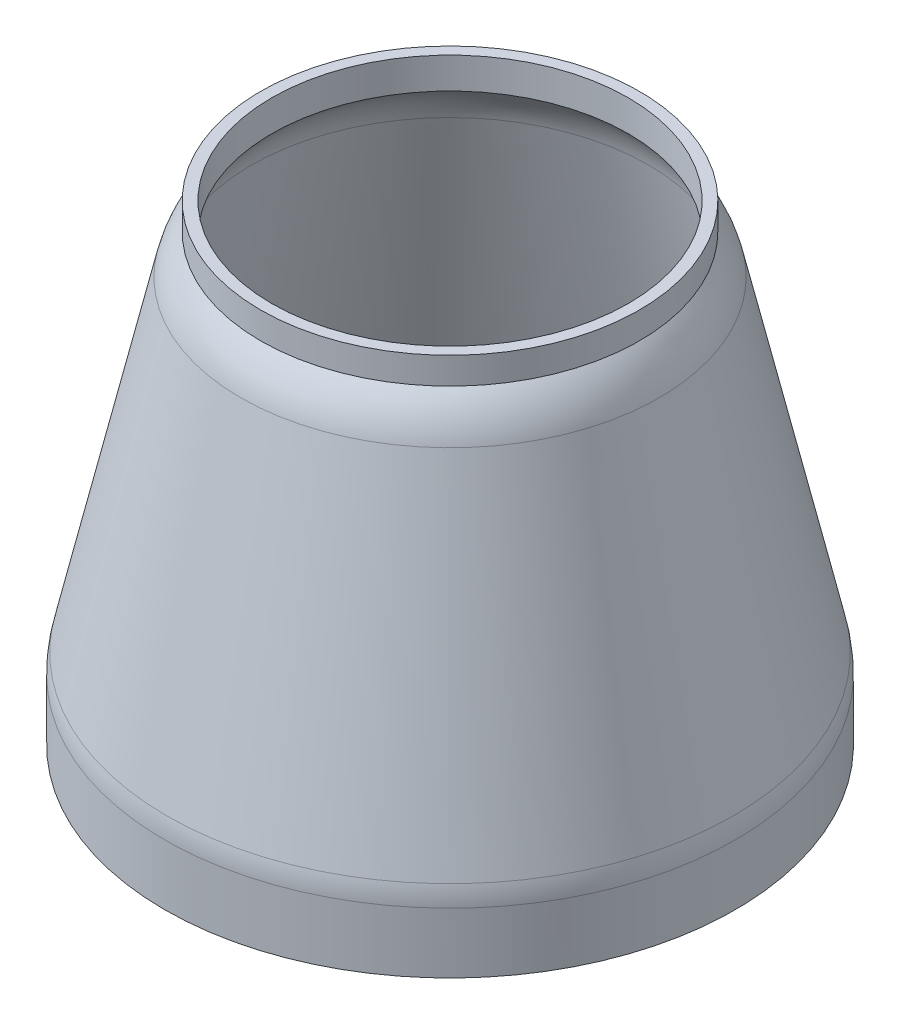
ISO-10303-21;
HEADER;
FILE_DESCRIPTION(('STEP AP214'),'2;1');
FILE_NAME('part.step','',(''),(''),'','','');
FILE_SCHEMA(('AUTOMOTIVE_DESIGN { 1 0 10303 214 1 1 1 1 }'));
ENDSEC;
DATA;
#1=APPLICATION_CONTEXT('core data for automotive mechanical design processes');
#2=APPLICATION_PROTOCOL_DEFINITION('international standard','automotive_design',2000,#1);
#3=PRODUCT_CONTEXT('',#1,'mechanical');
#4=PRODUCT('Part','Part','',(#3));
#5=PRODUCT_RELATED_PRODUCT_CATEGORY('part','',(#4));
#6=PRODUCT_DEFINITION_FORMATION('','',#4);
#7=PRODUCT_DEFINITION_CONTEXT('part definition',#1,'design');
#8=PRODUCT_DEFINITION('design','',#6,#7);
#9=PRODUCT_DEFINITION_SHAPE('','',#8);
#10=(LENGTH_UNIT() NAMED_UNIT(*) SI_UNIT(.MILLI.,.METRE.));
#11=(NAMED_UNIT(*) PLANE_ANGLE_UNIT() SI_UNIT($,.RADIAN.));
#12=(NAMED_UNIT(*) SI_UNIT($,.STERADIAN.) SOLID_ANGLE_UNIT());
#13=UNCERTAINTY_MEASURE_WITH_UNIT(LENGTH_MEASURE(1.E-05),#10,'distance_accuracy_value','');
#14=(GEOMETRIC_REPRESENTATION_CONTEXT(3) GLOBAL_UNCERTAINTY_ASSIGNED_CONTEXT((#13)) GLOBAL_UNIT_ASSIGNED_CONTEXT((#10,
#11,#12)) REPRESENTATION_CONTEXT('',''));
#15=CARTESIAN_POINT('',(0.,0.,0.));
#16=DIRECTION('',(0.,0.,1.));
#17=DIRECTION('',(1.,0.,0.));
#18=AXIS2_PLACEMENT_3D('',#15,#16,#17);
#19=CARTESIAN_POINT('',(0.,15.8,0.));
#20=DIRECTION('',(0.,-1.,0.));
#21=DIRECTION('',(0.,0.,-1.));
#22=AXIS2_PLACEMENT_3D('',#19,#20,#21);
#23=CYLINDRICAL_SURFACE('',#22,64.);
#24=CARTESIAN_POINT('',(0.,13.5663089692838,0.));
#25=DIRECTION('',(0.,-1.,0.));
#26=DIRECTION('',(0.,0.,-1.));
#27=AXIS2_PLACEMENT_3D('',#24,#25,#26);
#28=CIRCLE('',#27,64.);
#29=CARTESIAN_POINT('',(0.,13.5663089692838,-64.));
#30=VERTEX_POINT('',#29);
#31=EDGE_CURVE('E11',#30,#30,#28,.T.);
#32=ORIENTED_EDGE('',*,*,#31,.T.);
#33=EDGE_LOOP('',(#32));
#34=FACE_BOUND('',#33,.T.);
#35=CARTESIAN_POINT('',(0.,0.,0.));
#36=DIRECTION('',(0.,1.,0.));
#37=DIRECTION('',(0.,0.,1.));
#38=AXIS2_PLACEMENT_3D('',#35,#36,#37);
#39=CIRCLE('',#38,64.);
#40=CARTESIAN_POINT('',(0.,0.,64.));
#41=VERTEX_POINT('',#40);
#42=EDGE_CURVE('E51',#41,#41,#39,.T.);
#43=ORIENTED_EDGE('',*,*,#42,.T.);
#44=EDGE_LOOP('',(#43));
#45=FACE_BOUND('',#44,.T.);
#46=ADVANCED_FACE('F36',(#34,#45),#23,.T.);
#47=CARTESIAN_POINT('',(0.,0.,0.));
#48=DIRECTION('',(0.,1.,0.));
#49=DIRECTION('',(0.,0.,1.));
#50=AXIS2_PLACEMENT_3D('',#47,#48,#49);
#51=PLANE('',#50);
#52=CARTESIAN_POINT('',(0.,0.,0.));
#53=DIRECTION('',(0.,-1.,0.));
#54=DIRECTION('',(0.,0.,-1.));
#55=AXIS2_PLACEMENT_3D('',#52,#53,#54);
#56=CIRCLE('',#55,50.);
#57=CARTESIAN_POINT('',(0.,0.,-50.));
#58=VERTEX_POINT('',#57);
#59=EDGE_CURVE('E65',#58,#58,#56,.T.);
#60=ORIENTED_EDGE('',*,*,#59,.F.);
#61=EDGE_LOOP('',(#60));
#62=FACE_BOUND('',#61,.T.);
#63=ORIENTED_EDGE('',*,*,#42,.F.);
#64=EDGE_LOOP('',(#63));
#65=FACE_BOUND('',#64,.T.);
#66=ADVANCED_FACE('F115',(#62,#65),#51,.F.);
#67=CARTESIAN_POINT('',(0.,99.8,0.));
#68=DIRECTION('',(0.,-1.,0.));
#69=DIRECTION('',(0.,0.,-1.));
#70=AXIS2_PLACEMENT_3D('',#67,#68,#69);
#71=CONICAL_SURFACE('',#70,45.,0.222447265425942);
#72=CARTESIAN_POINT('',(0.,91.0034813089583,0.));
#73=DIRECTION('',(0.,-1.,0.));
#74=DIRECTION('',(0.,0.,-1.));
#75=AXIS2_PLACEMENT_3D('',#72,#73,#74);
#76=CIRCLE('',#75,46.9896887515452);
#77=CARTESIAN_POINT('',(0.,91.0034813089583,-46.9896887515452));
#78=VERTEX_POINT('',#77);
#79=EDGE_CURVE('E43',#78,#78,#76,.T.);
#80=ORIENTED_EDGE('',*,*,#79,.T.);
#81=EDGE_LOOP('',(#80));
#82=FACE_BOUND('',#81,.T.);
#83=CARTESIAN_POINT('',(0.,17.9786539149611,0.));
#84=DIRECTION('',(0.,-1.,0.));
#85=DIRECTION('',(0.,0.,-1.));
#86=AXIS2_PLACEMENT_3D('',#83,#84,#85);
#87=CIRCLE('',#86,63.5072092335207);
#88=CARTESIAN_POINT('',(0.,17.9786539149611,-63.5072092335207));
#89=VERTEX_POINT('',#88);
#90=EDGE_CURVE('E47',#89,#89,#87,.F.);
#91=ORIENTED_EDGE('',*,*,#90,.T.);
#92=EDGE_LOOP('',(#91));
#93=FACE_BOUND('',#92,.T.);
#94=ADVANCED_FACE('F120',(#82,#93),#71,.T.);
#95=CARTESIAN_POINT('',(0.,105.8,0.));
#96=DIRECTION('',(0.,-1.,0.));
#97=DIRECTION('',(0.,0.,-1.));
#98=AXIS2_PLACEMENT_3D('',#95,#96,#97);
#99=CYLINDRICAL_SURFACE('',#98,42.5);
#100=CARTESIAN_POINT('',(0.,105.8,0.));
#101=DIRECTION('',(0.,1.,0.));
#102=DIRECTION('',(0.,0.,1.));
#103=AXIS2_PLACEMENT_3D('',#100,#101,#102);
#104=CIRCLE('',#103,42.5);
#105=CARTESIAN_POINT('',(0.,105.8,42.5));
#106=VERTEX_POINT('',#105);
#107=EDGE_CURVE('E56',#106,#106,#104,.T.);
#108=ORIENTED_EDGE('',*,*,#107,.F.);
#109=EDGE_LOOP('',(#108));
#110=FACE_BOUND('',#109,.T.);
#111=CARTESIAN_POINT('',(0.,99.8,0.));
#112=DIRECTION('',(0.,1.,0.));
#113=DIRECTION('',(0.,0.,1.));
#114=AXIS2_PLACEMENT_3D('',#111,#112,#113);
#115=CIRCLE('',#114,42.5);
#116=CARTESIAN_POINT('',(0.,99.8,42.5));
#117=VERTEX_POINT('',#116);
#118=EDGE_CURVE('E57',#117,#117,#115,.T.);
#119=ORIENTED_EDGE('',*,*,#118,.T.);
#120=EDGE_LOOP('',(#119));
#121=FACE_BOUND('',#120,.T.);
#122=ADVANCED_FACE('F135',(#110,#121),#99,.T.);
#123=CARTESIAN_POINT('',(0.,105.8,0.));
#124=DIRECTION('',(0.,1.,0.));
#125=DIRECTION('',(0.,0.,1.));
#126=AXIS2_PLACEMENT_3D('',#123,#124,#125);
#127=PLANE('',#126);
#128=CARTESIAN_POINT('',(0.,105.8,0.));
#129=DIRECTION('',(0.,1.,0.));
#130=DIRECTION('',(0.,0.,1.));
#131=AXIS2_PLACEMENT_3D('',#128,#129,#130);
#132=CIRCLE('',#131,40.);
#133=CARTESIAN_POINT('',(0.,105.8,40.));
#134=VERTEX_POINT('',#133);
#135=EDGE_CURVE('E69',#134,#134,#132,.T.);
#136=ORIENTED_EDGE('',*,*,#135,.F.);
#137=EDGE_LOOP('',(#136));
#138=FACE_BOUND('',#137,.T.);
#139=ORIENTED_EDGE('',*,*,#107,.T.);
#140=EDGE_LOOP('',(#139));
#141=FACE_BOUND('',#140,.T.);
#142=ADVANCED_FACE('F127',(#138,#141),#127,.T.);
#143=CARTESIAN_POINT('',(0.,86.591136363281,0.));
#144=DIRECTION('',(0.,1.,0.));
#145=DIRECTION('',(0.,0.,1.));
#146=AXIS2_PLACEMENT_3D('',#143,#144,#145);
#147=TOROIDAL_SURFACE('',#146,27.4824795180244,20.);
#148=ORIENTED_EDGE('',*,*,#79,.F.);
#149=EDGE_LOOP('',(#148));
#150=FACE_BOUND('',#149,.T.);
#151=ORIENTED_EDGE('',*,*,#118,.F.);
#152=EDGE_LOOP('',(#151));
#153=FACE_BOUND('',#152,.T.);
#154=ADVANCED_FACE('F125',(#150,#153),#147,.T.);
#155=CARTESIAN_POINT('',(0.,13.5663089692838,0.));
#156=DIRECTION('',(0.,-1.,0.));
#157=DIRECTION('',(0.,0.,-1.));
#158=AXIS2_PLACEMENT_3D('',#155,#156,#157);
#159=TOROIDAL_SURFACE('',#158,44.,20.);
#160=ORIENTED_EDGE('',*,*,#31,.F.);
#161=EDGE_LOOP('',(#160));
#162=FACE_BOUND('',#161,.T.);
#163=ORIENTED_EDGE('',*,*,#90,.F.);
#164=EDGE_LOOP('',(#163));
#165=FACE_BOUND('',#164,.T.);
#166=ADVANCED_FACE('F38',(#162,#165),#159,.T.);
#167=CARTESIAN_POINT('',(0.,0.,0.));
#168=DIRECTION('',(0.,-1.,0.));
#169=DIRECTION('',(0.,0.,-1.));
#170=AXIS2_PLACEMENT_3D('',#167,#168,#169);
#171=CONICAL_SURFACE('',#170,50.,0.349065850398867);
#172=CARTESIAN_POINT('',(0.,6.,0.));
#173=DIRECTION('',(0.,-1.,0.));
#174=DIRECTION('',(0.,0.,-1.));
#175=AXIS2_PLACEMENT_3D('',#172,#173,#174);
#176=CIRCLE('',#175,47.8161785944028);
#177=CARTESIAN_POINT('',(0.,6.,-47.8161785944028));
#178=VERTEX_POINT('',#177);
#179=EDGE_CURVE('E60',#178,#178,#176,.T.);
#180=ORIENTED_EDGE('',*,*,#179,.F.);
#181=EDGE_LOOP('',(#180));
#182=FACE_BOUND('',#181,.T.);
#183=ORIENTED_EDGE('',*,*,#59,.T.);
#184=EDGE_LOOP('',(#183));
#185=FACE_BOUND('',#184,.T.);
#186=ADVANCED_FACE('F133',(#182,#185),#171,.F.);
#187=CARTESIAN_POINT('',(0.,6.,0.));
#188=DIRECTION('',(0.,-1.,0.));
#189=DIRECTION('',(0.,0.,-1.));
#190=AXIS2_PLACEMENT_3D('',#187,#188,#189);
#191=PLANE('',#190);
#192=ORIENTED_EDGE('',*,*,#179,.T.);
#193=EDGE_LOOP('',(#192));
#194=FACE_BOUND('',#193,.T.);
#195=ADVANCED_FACE('F100',(#194),#191,.T.);
#196=CARTESIAN_POINT('',(0.,15.8,0.));
#197=DIRECTION('',(0.,-1.,0.));
#198=DIRECTION('',(0.,0.,-1.));
#199=AXIS2_PLACEMENT_3D('',#196,#197,#198);
#200=CYLINDRICAL_SURFACE('',#199,61.5);
#201=CARTESIAN_POINT('',(0.,13.5663089692838,0.));
#202=DIRECTION('',(0.,-1.,0.));
#203=DIRECTION('',(0.,0.,-1.));
#204=AXIS2_PLACEMENT_3D('',#201,#202,#203);
#205=CIRCLE('',#204,61.5);
#206=CARTESIAN_POINT('',(0.,13.5663089692838,-61.5));
#207=VERTEX_POINT('',#206);
#208=EDGE_CURVE('E68',#207,#207,#205,.T.);
#209=ORIENTED_EDGE('',*,*,#208,.F.);
#210=EDGE_LOOP('',(#209));
#211=FACE_BOUND('',#210,.T.);
#212=CARTESIAN_POINT('',(0.,2.5,0.));
#213=DIRECTION('',(0.,1.,0.));
#214=DIRECTION('',(0.,0.,1.));
#215=AXIS2_PLACEMENT_3D('',#212,#213,#214);
#216=CIRCLE('',#215,61.5);
#217=CARTESIAN_POINT('',(0.,2.5,61.5));
#218=VERTEX_POINT('',#217);
#219=EDGE_CURVE('E72',#218,#218,#216,.T.);
#220=ORIENTED_EDGE('',*,*,#219,.F.);
#221=EDGE_LOOP('',(#220));
#222=FACE_BOUND('',#221,.T.);
#223=ADVANCED_FACE('F96',(#211,#222),#200,.F.);
#224=CARTESIAN_POINT('',(0.,2.5,0.));
#225=DIRECTION('',(0.,1.,0.));
#226=DIRECTION('',(0.,0.,1.));
#227=AXIS2_PLACEMENT_3D('',#224,#225,#226);
#228=PLANE('',#227);
#229=CARTESIAN_POINT('',(0.,2.5,0.));
#230=DIRECTION('',(0.,1.,0.));
#231=DIRECTION('',(0.,0.,1.));
#232=AXIS2_PLACEMENT_3D('',#229,#230,#231);
#233=CIRCLE('',#232,51.7505188455243);
#234=CARTESIAN_POINT('',(0.,2.5,51.7505188455243));
#235=VERTEX_POINT('',#234);
#236=EDGE_CURVE('E85',#235,#235,#233,.F.);
#237=ORIENTED_EDGE('',*,*,#236,.T.);
#238=EDGE_LOOP('',(#237));
#239=FACE_BOUND('',#238,.T.);
#240=ORIENTED_EDGE('',*,*,#219,.T.);
#241=EDGE_LOOP('',(#240));
#242=FACE_BOUND('',#241,.T.);
#243=ADVANCED_FACE('F99',(#239,#242),#228,.T.);
#244=CARTESIAN_POINT('',(0.,99.2484568817903,0.));
#245=DIRECTION('',(0.,-1.,0.));
#246=DIRECTION('',(0.,0.,-1.));
#247=AXIS2_PLACEMENT_3D('',#244,#245,#246);
#248=CONICAL_SURFACE('',#247,42.5615988458099,0.222447265425942);
#249=CARTESIAN_POINT('',(0.,90.4519381907486,0.));
#250=DIRECTION('',(0.,-1.,0.));
#251=DIRECTION('',(0.,0.,-1.));
#252=AXIS2_PLACEMENT_3D('',#249,#250,#251);
#253=CIRCLE('',#252,44.5512875973551);
#254=CARTESIAN_POINT('',(0.,90.4519381907486,-44.5512875973551));
#255=VERTEX_POINT('',#254);
#256=EDGE_CURVE('E77',#255,#255,#253,.T.);
#257=ORIENTED_EDGE('',*,*,#256,.F.);
#258=EDGE_LOOP('',(#257));
#259=FACE_BOUND('',#258,.T.);
#260=CARTESIAN_POINT('',(0.,17.4271107967514,0.));
#261=DIRECTION('',(0.,-1.,0.));
#262=DIRECTION('',(0.,0.,-1.));
#263=AXIS2_PLACEMENT_3D('',#260,#261,#262);
#264=CIRCLE('',#263,61.0688080793306);
#265=CARTESIAN_POINT('',(0.,17.4271107967514,-61.0688080793306));
#266=VERTEX_POINT('',#265);
#267=EDGE_CURVE('E80',#266,#266,#264,.F.);
#268=ORIENTED_EDGE('',*,*,#267,.F.);
#269=EDGE_LOOP('',(#268));
#270=FACE_BOUND('',#269,.T.);
#271=ADVANCED_FACE('F105',(#259,#270),#248,.F.);
#272=CARTESIAN_POINT('',(0.,105.8,0.));
#273=DIRECTION('',(0.,-1.,0.));
#274=DIRECTION('',(0.,0.,-1.));
#275=AXIS2_PLACEMENT_3D('',#272,#273,#274);
#276=CYLINDRICAL_SURFACE('',#275,40.);
#277=ORIENTED_EDGE('',*,*,#135,.T.);
#278=EDGE_LOOP('',(#277));
#279=FACE_BOUND('',#278,.T.);
#280=CARTESIAN_POINT('',(0.,98.8206776867862,0.));
#281=DIRECTION('',(0.,-1.,0.));
#282=DIRECTION('',(0.,0.,-1.));
#283=AXIS2_PLACEMENT_3D('',#280,#281,#282);
#284=CIRCLE('',#283,40.);
#285=CARTESIAN_POINT('',(0.,98.8206776867862,-40.));
#286=VERTEX_POINT('',#285);
#287=EDGE_CURVE('E73',#286,#286,#284,.F.);
#288=ORIENTED_EDGE('',*,*,#287,.F.);
#289=EDGE_LOOP('',(#288));
#290=FACE_BOUND('',#289,.T.);
#291=ADVANCED_FACE('F111',(#279,#290),#276,.F.);
#292=CARTESIAN_POINT('',(0.,86.591136363281,0.));
#293=DIRECTION('',(0.,1.,0.));
#294=DIRECTION('',(0.,0.,1.));
#295=AXIS2_PLACEMENT_3D('',#292,#293,#294);
#296=TOROIDAL_SURFACE('',#295,27.4824795180244,17.5);
#297=ORIENTED_EDGE('',*,*,#256,.T.);
#298=EDGE_LOOP('',(#297));
#299=FACE_BOUND('',#298,.T.);
#300=ORIENTED_EDGE('',*,*,#287,.T.);
#301=EDGE_LOOP('',(#300));
#302=FACE_BOUND('',#301,.T.);
#303=ADVANCED_FACE('F165',(#299,#302),#296,.F.);
#304=CARTESIAN_POINT('',(0.,13.5663089692838,0.));
#305=DIRECTION('',(0.,-1.,0.));
#306=DIRECTION('',(0.,0.,-1.));
#307=AXIS2_PLACEMENT_3D('',#304,#305,#306);
#308=TOROIDAL_SURFACE('',#307,44.,17.5);
#309=ORIENTED_EDGE('',*,*,#208,.T.);
#310=EDGE_LOOP('',(#309));
#311=FACE_BOUND('',#310,.T.);
#312=ORIENTED_EDGE('',*,*,#267,.T.);
#313=EDGE_LOOP('',(#312));
#314=FACE_BOUND('',#313,.T.);
#315=ADVANCED_FACE('F93',(#311,#314),#308,.F.);
#316=CARTESIAN_POINT('',(0.,0.855050358314174,0.));
#317=DIRECTION('',(0.,-1.,0.));
#318=DIRECTION('',(0.,0.,-1.));
#319=AXIS2_PLACEMENT_3D('',#316,#317,#318);
#320=CONICAL_SURFACE('',#319,52.3492315519648,0.349065850398867);
#321=CARTESIAN_POINT('',(0.,8.5,0.));
#322=DIRECTION('',(0.,-1.,0.));
#323=DIRECTION('',(0.,0.,-1.));
#324=AXIS2_PLACEMENT_3D('',#321,#322,#323);
#325=CIRCLE('',#324,49.5666974399271);
#326=CARTESIAN_POINT('',(0.,8.5,-49.5666974399271));
#327=VERTEX_POINT('',#326);
#328=EDGE_CURVE('E76',#327,#327,#325,.T.);
#329=ORIENTED_EDGE('',*,*,#328,.T.);
#330=EDGE_LOOP('',(#329));
#331=FACE_BOUND('',#330,.T.);
#332=ORIENTED_EDGE('',*,*,#236,.F.);
#333=EDGE_LOOP('',(#332));
#334=FACE_BOUND('',#333,.T.);
#335=ADVANCED_FACE('F158',(#331,#334),#320,.T.);
#336=CARTESIAN_POINT('',(0.,8.5,0.));
#337=DIRECTION('',(0.,-1.,0.));
#338=DIRECTION('',(0.,0.,-1.));
#339=AXIS2_PLACEMENT_3D('',#336,#337,#338);
#340=PLANE('',#339);
#341=ORIENTED_EDGE('',*,*,#328,.F.);
#342=EDGE_LOOP('',(#341));
#343=FACE_BOUND('',#342,.T.);
#344=ADVANCED_FACE('F155',(#343),#340,.F.);
#345=CLOSED_SHELL('',(#46,#66,#94,#122,#142,#154,#166,#186,#195,#223,#243,#271,#291,#303,#315,
#335,#344));
#346=MANIFOLD_SOLID_BREP('B2',#345);
#347=ADVANCED_BREP_SHAPE_REPRESENTATION('',(#18,#346),#14);
#348=SHAPE_DEFINITION_REPRESENTATION(#9,#347);
ENDSEC;
END-ISO-10303-21;
